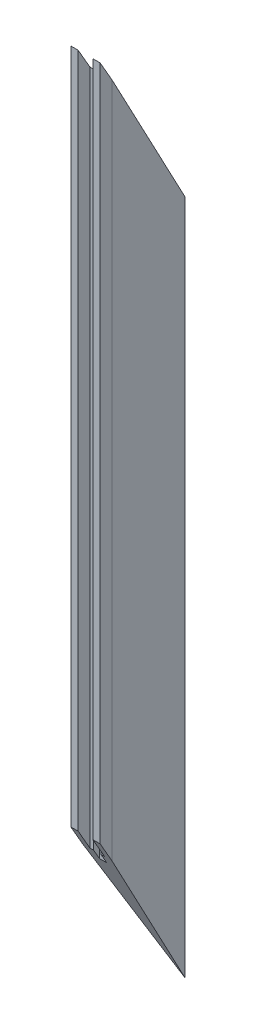
ISO-10303-21;
HEADER;
FILE_DESCRIPTION(('STEP AP214'),'2;1');
FILE_NAME('part.step','',(''),(''),'','','');
FILE_SCHEMA(('AUTOMOTIVE_DESIGN { 1 0 10303 214 1 1 1 1 }'));
ENDSEC;
DATA;
#1=APPLICATION_CONTEXT('core data for automotive mechanical design processes');
#2=APPLICATION_PROTOCOL_DEFINITION('international standard','automotive_design',2000,#1);
#3=PRODUCT_CONTEXT('',#1,'mechanical');
#4=PRODUCT('Part','Part','',(#3));
#5=PRODUCT_RELATED_PRODUCT_CATEGORY('part','',(#4));
#6=PRODUCT_DEFINITION_FORMATION('','',#4);
#7=PRODUCT_DEFINITION_CONTEXT('part definition',#1,'design');
#8=PRODUCT_DEFINITION('design','',#6,#7);
#9=PRODUCT_DEFINITION_SHAPE('','',#8);
#10=(LENGTH_UNIT() NAMED_UNIT(*) SI_UNIT(.MILLI.,.METRE.));
#11=(NAMED_UNIT(*) PLANE_ANGLE_UNIT() SI_UNIT($,.RADIAN.));
#12=(NAMED_UNIT(*) SI_UNIT($,.STERADIAN.) SOLID_ANGLE_UNIT());
#13=UNCERTAINTY_MEASURE_WITH_UNIT(LENGTH_MEASURE(1.E-05),#10,'distance_accuracy_value','');
#14=(GEOMETRIC_REPRESENTATION_CONTEXT(3) GLOBAL_UNCERTAINTY_ASSIGNED_CONTEXT((#13)) GLOBAL_UNIT_ASSIGNED_CONTEXT((#10,
#11,#12)) REPRESENTATION_CONTEXT('',''));
#15=CARTESIAN_POINT('',(0.,0.,0.));
#16=DIRECTION('',(0.,0.,1.));
#17=DIRECTION('',(1.,0.,0.));
#18=AXIS2_PLACEMENT_3D('',#15,#16,#17);
#19=CARTESIAN_POINT('',(0.,369.316,-2.54));
#20=DIRECTION('',(0.,0.,-1.));
#21=DIRECTION('',(-1.,0.,0.));
#22=AXIS2_PLACEMENT_3D('',#19,#20,#21);
#23=PLANE('',#22);
#24=DIRECTION('',(0.,-1.,0.));
#25=VECTOR('',#24,1.);
#26=CARTESIAN_POINT('',(-1.5875,369.316,-2.54));
#27=LINE('',#26,#25);
#28=CARTESIAN_POINT('',(-1.5875,356.064413852362,-2.54));
#29=VERTEX_POINT('',#28);
#30=CARTESIAN_POINT('',(-1.5875,62.9484138523619,-2.53999999999999));
#31=VERTEX_POINT('',#30);
#32=EDGE_CURVE('E214',#29,#31,#27,.T.);
#33=ORIENTED_EDGE('',*,*,#32,.T.);
#34=DIRECTION('',(1.,0.,0.));
#35=VECTOR('',#34,1.);
#36=CARTESIAN_POINT('',(0.,62.9484138523619,-2.54));
#37=LINE('',#36,#35);
#38=CARTESIAN_POINT('',(1.5875,62.9484138523619,-2.54));
#39=VERTEX_POINT('',#38);
#40=EDGE_CURVE('E62',#31,#39,#37,.T.);
#41=ORIENTED_EDGE('',*,*,#40,.T.);
#42=DIRECTION('',(0.,-1.,0.));
#43=VECTOR('',#42,1.);
#44=CARTESIAN_POINT('',(1.5875,369.316,-2.54));
#45=LINE('',#44,#43);
#46=CARTESIAN_POINT('',(1.5875,356.064413852362,-2.54));
#47=VERTEX_POINT('',#46);
#48=EDGE_CURVE('E55',#47,#39,#45,.T.);
#49=ORIENTED_EDGE('',*,*,#48,.F.);
#50=DIRECTION('',(-1.,0.,0.));
#51=VECTOR('',#50,1.);
#52=CARTESIAN_POINT('',(0.,356.064413852362,-2.54));
#53=LINE('',#52,#51);
#54=EDGE_CURVE('E212',#47,#29,#53,.T.);
#55=ORIENTED_EDGE('',*,*,#54,.T.);
#56=EDGE_LOOP('',(#33,#41,#49,#55));
#57=FACE_BOUND('',#56,.T.);
#58=ADVANCED_FACE('F47',(#57),#23,.F.);
#59=CARTESIAN_POINT('',(1.5875,369.316,0.));
#60=DIRECTION('',(1.,0.,0.));
#61=DIRECTION('',(0.,0.,-1.));
#62=AXIS2_PLACEMENT_3D('',#59,#60,#61);
#63=PLANE('',#62);
#64=ORIENTED_EDGE('',*,*,#48,.T.);
#65=DIRECTION('',(0.,0.866896748935602,0.498487739753831));
#66=VECTOR('',#65,1.);
#67=CARTESIAN_POINT('',(1.5875000000001,294.284339341271,130.484057089172));
#68=LINE('',#67,#66);
#69=CARTESIAN_POINT('',(1.5875,67.3656092349079,0.));
#70=VERTEX_POINT('',#69);
#71=EDGE_CURVE('E207',#39,#70,#68,.T.);
#72=ORIENTED_EDGE('',*,*,#71,.T.);
#73=DIRECTION('',(0.,-1.,0.));
#74=VECTOR('',#73,1.);
#75=CARTESIAN_POINT('',(1.5875,369.316,0.));
#76=LINE('',#75,#74);
#77=CARTESIAN_POINT('',(1.5875,360.481609234908,0.));
#78=VERTEX_POINT('',#77);
#79=EDGE_CURVE('E196',#78,#70,#76,.T.);
#80=ORIENTED_EDGE('',*,*,#79,.F.);
#81=DIRECTION('',(0.,-0.866896748935602,-0.498487739753831));
#82=VECTOR('',#81,1.);
#83=CARTESIAN_POINT('',(1.58750000000001,367.120742003038,3.81767066444079));
#84=LINE('',#83,#82);
#85=EDGE_CURVE('E208',#78,#47,#84,.T.);
#86=ORIENTED_EDGE('',*,*,#85,.T.);
#87=EDGE_LOOP('',(#64,#72,#80,#86));
#88=FACE_BOUND('',#87,.T.);
#89=ADVANCED_FACE('F205',(#88),#63,.F.);
#90=CARTESIAN_POINT('',(0.,369.316,0.));
#91=DIRECTION('',(0.,0.,-1.));
#92=DIRECTION('',(-1.,0.,0.));
#93=AXIS2_PLACEMENT_3D('',#90,#91,#92);
#94=PLANE('',#93);
#95=ORIENTED_EDGE('',*,*,#79,.T.);
#96=DIRECTION('',(1.,0.,0.));
#97=VECTOR('',#96,1.);
#98=CARTESIAN_POINT('',(0.,67.365609234908,0.));
#99=LINE('',#98,#97);
#100=CARTESIAN_POINT('',(3.175,67.365609234908,0.));
#101=VERTEX_POINT('',#100);
#102=EDGE_CURVE('E219',#70,#101,#99,.T.);
#103=ORIENTED_EDGE('',*,*,#102,.T.);
#104=DIRECTION('',(0.,-1.,0.));
#105=VECTOR('',#104,1.);
#106=CARTESIAN_POINT('',(3.175,369.316,0.));
#107=LINE('',#106,#105);
#108=CARTESIAN_POINT('',(3.175,360.481609234908,0.));
#109=VERTEX_POINT('',#108);
#110=EDGE_CURVE('E192',#109,#101,#107,.T.);
#111=ORIENTED_EDGE('',*,*,#110,.F.);
#112=DIRECTION('',(-1.,0.,0.));
#113=VECTOR('',#112,1.);
#114=CARTESIAN_POINT('',(0.,360.481609234908,0.));
#115=LINE('',#114,#113);
#116=EDGE_CURVE('E260',#109,#78,#115,.T.);
#117=ORIENTED_EDGE('',*,*,#116,.T.);
#118=EDGE_LOOP('',(#95,#103,#111,#117));
#119=FACE_BOUND('',#118,.T.);
#120=ADVANCED_FACE('F319',(#119),#94,.F.);
#121=CARTESIAN_POINT('',(3.175,369.316,0.));
#122=DIRECTION('',(1.,0.,0.));
#123=DIRECTION('',(0.,0.,-1.));
#124=AXIS2_PLACEMENT_3D('',#121,#122,#123);
#125=PLANE('',#124);
#126=ORIENTED_EDGE('',*,*,#110,.T.);
#127=DIRECTION('',(0.,0.866896748935602,0.498487739753831));
#128=VECTOR('',#127,1.);
#129=CARTESIAN_POINT('',(3.175,294.284339341271,130.484057089172));
#130=LINE('',#129,#128);
#131=CARTESIAN_POINT('',(3.175,76.2,5.08));
#132=VERTEX_POINT('',#131);
#133=EDGE_CURVE('E228',#101,#132,#130,.T.);
#134=ORIENTED_EDGE('',*,*,#133,.T.);
#135=DIRECTION('',(0.,-1.,0.));
#136=VECTOR('',#135,1.);
#137=CARTESIAN_POINT('',(3.175,369.316,5.08));
#138=LINE('',#137,#136);
#139=CARTESIAN_POINT('',(3.175,369.316,5.08));
#140=VERTEX_POINT('',#139);
#141=EDGE_CURVE('E188',#140,#132,#138,.T.);
#142=ORIENTED_EDGE('',*,*,#141,.F.);
#143=DIRECTION('',(0.,-0.866896748935602,-0.498487739753831));
#144=VECTOR('',#143,1.);
#145=CARTESIAN_POINT('',(3.175,367.120742003038,3.81767066444079));
#146=LINE('',#145,#144);
#147=EDGE_CURVE('E69',#140,#109,#146,.T.);
#148=ORIENTED_EDGE('',*,*,#147,.T.);
#149=EDGE_LOOP('',(#126,#134,#142,#148));
#150=FACE_BOUND('',#149,.T.);
#151=ADVANCED_FACE('F316',(#150),#125,.F.);
#152=CARTESIAN_POINT('',(0.,369.316,5.08));
#153=DIRECTION('',(0.,0.,-1.));
#154=DIRECTION('',(-1.,0.,0.));
#155=AXIS2_PLACEMENT_3D('',#152,#153,#154);
#156=PLANE('',#155);
#157=ORIENTED_EDGE('',*,*,#141,.T.);
#158=DIRECTION('',(-1.,0.,0.));
#159=VECTOR('',#158,1.);
#160=CARTESIAN_POINT('',(11.176,76.2,5.08));
#161=LINE('',#160,#159);
#162=CARTESIAN_POINT('',(6.35,76.2,5.08));
#163=VERTEX_POINT('',#162);
#164=EDGE_CURVE('E151',#163,#132,#161,.T.);
#165=ORIENTED_EDGE('',*,*,#164,.F.);
#166=DIRECTION('',(0.,-1.,0.));
#167=VECTOR('',#166,1.);
#168=CARTESIAN_POINT('',(6.35,369.316,5.08));
#169=LINE('',#168,#167);
#170=CARTESIAN_POINT('',(6.35,369.316,5.08));
#171=VERTEX_POINT('',#170);
#172=EDGE_CURVE('E184',#171,#163,#169,.T.);
#173=ORIENTED_EDGE('',*,*,#172,.F.);
#174=DIRECTION('',(1.,0.,0.));
#175=VECTOR('',#174,1.);
#176=CARTESIAN_POINT('',(0.,369.316,5.08));
#177=LINE('',#176,#175);
#178=EDGE_CURVE('E277',#140,#171,#177,.T.);
#179=ORIENTED_EDGE('',*,*,#178,.F.);
#180=EDGE_LOOP('',(#157,#165,#173,#179));
#181=FACE_BOUND('',#180,.T.);
#182=ADVANCED_FACE('F311',(#181),#156,.F.);
#183=CARTESIAN_POINT('',(6.35,369.316,0.));
#184=DIRECTION('',(-1.,0.,0.));
#185=DIRECTION('',(0.,0.,1.));
#186=AXIS2_PLACEMENT_3D('',#183,#184,#185);
#187=PLANE('',#186);
#188=ORIENTED_EDGE('',*,*,#172,.T.);
#189=DIRECTION('',(0.,-0.866896748935602,-0.498487739753831));
#190=VECTOR('',#189,1.);
#191=CARTESIAN_POINT('',(6.35,294.284339341271,130.484057089172));
#192=LINE('',#191,#190);
#193=CARTESIAN_POINT('',(6.35,67.365609234908,0.));
#194=VERTEX_POINT('',#193);
#195=EDGE_CURVE('E238',#163,#194,#192,.T.);
#196=ORIENTED_EDGE('',*,*,#195,.T.);
#197=DIRECTION('',(0.,-1.,0.));
#198=VECTOR('',#197,1.);
#199=CARTESIAN_POINT('',(6.35,369.316,0.));
#200=LINE('',#199,#198);
#201=CARTESIAN_POINT('',(6.35,360.481609234908,0.));
#202=VERTEX_POINT('',#201);
#203=EDGE_CURVE('E180',#202,#194,#200,.T.);
#204=ORIENTED_EDGE('',*,*,#203,.F.);
#205=DIRECTION('',(0.,0.866896748935602,0.498487739753831));
#206=VECTOR('',#205,1.);
#207=CARTESIAN_POINT('',(6.35,367.120742003038,3.81767066444079));
#208=LINE('',#207,#206);
#209=EDGE_CURVE('E273',#202,#171,#208,.T.);
#210=ORIENTED_EDGE('',*,*,#209,.T.);
#211=EDGE_LOOP('',(#188,#196,#204,#210));
#212=FACE_BOUND('',#211,.T.);
#213=ADVANCED_FACE('F307',(#212),#187,.F.);
#214=CARTESIAN_POINT('',(6.17837837837838,369.316,-1.02972972972973));
#215=DIRECTION('',(0.986393923832144,0.,-0.164398987305357));
#216=DIRECTION('',(-0.164398987305357,0.,-0.986393923832144));
#217=AXIS2_PLACEMENT_3D('',#214,#215,#216);
#218=PLANE('',#217);
#219=DIRECTION('',(0.0827960315270938,0.863920271231371,0.496776189162563));
#220=VECTOR('',#219,1.);
#221=CARTESIAN_POINT('',(27.9047304257473,292.274559727748,129.328382554484));
#222=LINE('',#221,#220);
#223=CARTESIAN_POINT('',(0.,1.10767849671754,-38.1));
#224=VERTEX_POINT('',#223);
#225=EDGE_CURVE('E235',#224,#194,#222,.T.);
#226=ORIENTED_EDGE('',*,*,#225,.F.);
#227=DIRECTION('',(0.,-1.,0.));
#228=VECTOR('',#227,1.);
#229=CARTESIAN_POINT('',(0.,369.316,-38.1));
#230=LINE('',#229,#228);
#231=CARTESIAN_POINT('',(0.,294.223678496717,-38.1));
#232=VERTEX_POINT('',#231);
#233=EDGE_CURVE('E171',#232,#224,#230,.T.);
#234=ORIENTED_EDGE('',*,*,#233,.F.);
#235=DIRECTION('',(-0.0827960315270937,-0.863920271231371,-0.496776189162562));
#236=VECTOR('',#235,1.);
#237=CARTESIAN_POINT('',(6.9383862279917,366.621019304448,3.53031736795018));
#238=LINE('',#237,#236);
#239=EDGE_CURVE('E270',#202,#232,#238,.T.);
#240=ORIENTED_EDGE('',*,*,#239,.F.);
#241=ORIENTED_EDGE('',*,*,#203,.T.);
#242=EDGE_LOOP('',(#226,#234,#240,#241));
#243=FACE_BOUND('',#242,.T.);
#244=ADVANCED_FACE('F303',(#243),#218,.T.);
#245=CARTESIAN_POINT('',(-6.17837837837838,369.316,-1.02972972972973));
#246=DIRECTION('',(0.986393923832144,0.,0.164398987305357));
#247=DIRECTION('',(0.164398987305357,0.,-0.986393923832144));
#248=AXIS2_PLACEMENT_3D('',#245,#246,#247);
#249=PLANE('',#248);
#250=ORIENTED_EDGE('',*,*,#233,.T.);
#251=DIRECTION('',(-0.0827960315270938,0.863920271231371,0.496776189162563));
#252=VECTOR('',#251,1.);
#253=CARTESIAN_POINT('',(-27.9047304257473,292.274559727748,129.328382554484));
#254=LINE('',#253,#252);
#255=CARTESIAN_POINT('',(-6.35,67.365609234908,0.));
#256=VERTEX_POINT('',#255);
#257=EDGE_CURVE('E232',#224,#256,#254,.T.);
#258=ORIENTED_EDGE('',*,*,#257,.T.);
#259=DIRECTION('',(0.,-1.,0.));
#260=VECTOR('',#259,1.);
#261=CARTESIAN_POINT('',(-6.35,369.316,0.));
#262=LINE('',#261,#260);
#263=CARTESIAN_POINT('',(-6.35,360.481609234908,0.));
#264=VERTEX_POINT('',#263);
#265=EDGE_CURVE('E161',#264,#256,#262,.T.);
#266=ORIENTED_EDGE('',*,*,#265,.F.);
#267=DIRECTION('',(0.0827960315270937,-0.863920271231371,-0.496776189162562));
#268=VECTOR('',#267,1.);
#269=CARTESIAN_POINT('',(-6.9383862279917,366.621019304448,3.53031736795018));
#270=LINE('',#269,#268);
#271=EDGE_CURVE('E266',#264,#232,#270,.T.);
#272=ORIENTED_EDGE('',*,*,#271,.T.);
#273=EDGE_LOOP('',(#250,#258,#266,#272));
#274=FACE_BOUND('',#273,.T.);
#275=ADVANCED_FACE('F299',(#274),#249,.F.);
#276=CARTESIAN_POINT('',(-6.35,369.316,0.));
#277=DIRECTION('',(-1.,0.,0.));
#278=DIRECTION('',(0.,0.,1.));
#279=AXIS2_PLACEMENT_3D('',#276,#277,#278);
#280=PLANE('',#279);
#281=DIRECTION('',(0.,-0.866896748935602,-0.498487739753831));
#282=VECTOR('',#281,1.);
#283=CARTESIAN_POINT('',(-6.35,76.2,5.08));
#284=LINE('',#283,#282);
#285=CARTESIAN_POINT('',(-6.35,76.2,5.08));
#286=VERTEX_POINT('',#285);
#287=EDGE_CURVE('E142',#286,#256,#284,.T.);
#288=ORIENTED_EDGE('',*,*,#287,.F.);
#289=DIRECTION('',(0.,-1.,0.));
#290=VECTOR('',#289,1.);
#291=CARTESIAN_POINT('',(-6.35,369.316,5.08));
#292=LINE('',#291,#290);
#293=CARTESIAN_POINT('',(-6.35,369.316,5.08));
#294=VERTEX_POINT('',#293);
#295=EDGE_CURVE('E158',#294,#286,#292,.T.);
#296=ORIENTED_EDGE('',*,*,#295,.F.);
#297=DIRECTION('',(0.,0.866896748935602,0.498487739753831));
#298=VECTOR('',#297,1.);
#299=CARTESIAN_POINT('',(-6.35,369.316,5.08));
#300=LINE('',#299,#298);
#301=EDGE_CURVE('E242',#264,#294,#300,.T.);
#302=ORIENTED_EDGE('',*,*,#301,.F.);
#303=ORIENTED_EDGE('',*,*,#265,.T.);
#304=EDGE_LOOP('',(#288,#296,#302,#303));
#305=FACE_BOUND('',#304,.T.);
#306=ADVANCED_FACE('F156',(#305),#280,.T.);
#307=CARTESIAN_POINT('',(0.,369.316,5.08));
#308=DIRECTION('',(0.,0.,1.));
#309=DIRECTION('',(1.,0.,0.));
#310=AXIS2_PLACEMENT_3D('',#307,#308,#309);
#311=PLANE('',#310);
#312=CARTESIAN_POINT('',(-3.175,76.2,5.08));
#313=VERTEX_POINT('',#312);
#314=EDGE_CURVE('E139',#313,#286,#161,.T.);
#315=ORIENTED_EDGE('',*,*,#314,.F.);
#316=DIRECTION('',(0.,-1.,0.));
#317=VECTOR('',#316,1.);
#318=CARTESIAN_POINT('',(-3.175,369.316,5.08));
#319=LINE('',#318,#317);
#320=CARTESIAN_POINT('',(-3.175,369.316,5.08));
#321=VERTEX_POINT('',#320);
#322=EDGE_CURVE('E167',#321,#313,#319,.T.);
#323=ORIENTED_EDGE('',*,*,#322,.F.);
#324=DIRECTION('',(-1.,0.,0.));
#325=VECTOR('',#324,1.);
#326=CARTESIAN_POINT('',(0.,369.316,5.08));
#327=LINE('',#326,#325);
#328=EDGE_CURVE('E165',#321,#294,#327,.T.);
#329=ORIENTED_EDGE('',*,*,#328,.T.);
#330=ORIENTED_EDGE('',*,*,#295,.T.);
#331=EDGE_LOOP('',(#315,#323,#329,#330));
#332=FACE_BOUND('',#331,.T.);
#333=ADVANCED_FACE('F164',(#332),#311,.T.);
#334=CARTESIAN_POINT('',(-3.175,369.316,0.));
#335=DIRECTION('',(1.,0.,0.));
#336=DIRECTION('',(0.,0.,-1.));
#337=AXIS2_PLACEMENT_3D('',#334,#335,#336);
#338=PLANE('',#337);
#339=DIRECTION('',(0.,0.866896748935602,0.498487739753831));
#340=VECTOR('',#339,1.);
#341=CARTESIAN_POINT('',(-3.17499999999998,294.284339341271,130.484057089172));
#342=LINE('',#341,#340);
#343=CARTESIAN_POINT('',(-3.175,67.365609234908,0.));
#344=VERTEX_POINT('',#343);
#345=EDGE_CURVE('E145',#344,#313,#342,.T.);
#346=ORIENTED_EDGE('',*,*,#345,.F.);
#347=DIRECTION('',(0.,-1.,0.));
#348=VECTOR('',#347,1.);
#349=CARTESIAN_POINT('',(-3.175,369.316,0.));
#350=LINE('',#349,#348);
#351=CARTESIAN_POINT('',(-3.175,360.481609234908,0.));
#352=VERTEX_POINT('',#351);
#353=EDGE_CURVE('E173',#352,#344,#350,.T.);
#354=ORIENTED_EDGE('',*,*,#353,.F.);
#355=DIRECTION('',(0.,-0.866896748935602,-0.498487739753831));
#356=VECTOR('',#355,1.);
#357=CARTESIAN_POINT('',(-3.175,367.120742003038,3.81767066444079));
#358=LINE('',#357,#356);
#359=EDGE_CURVE('E253',#321,#352,#358,.T.);
#360=ORIENTED_EDGE('',*,*,#359,.F.);
#361=ORIENTED_EDGE('',*,*,#322,.T.);
#362=EDGE_LOOP('',(#346,#354,#360,#361));
#363=FACE_BOUND('',#362,.T.);
#364=ADVANCED_FACE('F296',(#363),#338,.T.);
#365=CARTESIAN_POINT('',(0.,369.316,0.));
#366=DIRECTION('',(0.,0.,-1.));
#367=DIRECTION('',(-1.,0.,0.));
#368=AXIS2_PLACEMENT_3D('',#365,#366,#367);
#369=PLANE('',#368);
#370=ORIENTED_EDGE('',*,*,#353,.T.);
#371=DIRECTION('',(1.,0.,0.));
#372=VECTOR('',#371,1.);
#373=CARTESIAN_POINT('',(-1.286143230663E-13,67.365609234908,0.));
#374=LINE('',#373,#372);
#375=CARTESIAN_POINT('',(-1.5875,67.3656092349079,0.));
#376=VERTEX_POINT('',#375);
#377=EDGE_CURVE('E221',#344,#376,#374,.T.);
#378=ORIENTED_EDGE('',*,*,#377,.T.);
#379=DIRECTION('',(0.,-1.,0.));
#380=VECTOR('',#379,1.);
#381=CARTESIAN_POINT('',(-1.5875,369.316,0.));
#382=LINE('',#381,#380);
#383=CARTESIAN_POINT('',(-1.5875,360.481609234908,0.));
#384=VERTEX_POINT('',#383);
#385=EDGE_CURVE('E284',#384,#376,#382,.T.);
#386=ORIENTED_EDGE('',*,*,#385,.F.);
#387=DIRECTION('',(-1.,0.,0.));
#388=VECTOR('',#387,1.);
#389=CARTESIAN_POINT('',(0.,360.481609234908,0.));
#390=LINE('',#389,#388);
#391=EDGE_CURVE('E249',#384,#352,#390,.T.);
#392=ORIENTED_EDGE('',*,*,#391,.T.);
#393=EDGE_LOOP('',(#370,#378,#386,#392));
#394=FACE_BOUND('',#393,.T.);
#395=ADVANCED_FACE('F292',(#394),#369,.F.);
#396=CARTESIAN_POINT('',(-1.5875,369.316,0.));
#397=DIRECTION('',(-1.,0.,0.));
#398=DIRECTION('',(0.,0.,1.));
#399=AXIS2_PLACEMENT_3D('',#396,#397,#398);
#400=PLANE('',#399);
#401=ORIENTED_EDGE('',*,*,#385,.T.);
#402=DIRECTION('',(0.,-0.866896748935602,-0.498487739753831));
#403=VECTOR('',#402,1.);
#404=CARTESIAN_POINT('',(-1.5875,294.284339341271,130.484057089172));
#405=LINE('',#404,#403);
#406=EDGE_CURVE('E11',#376,#31,#405,.T.);
#407=ORIENTED_EDGE('',*,*,#406,.T.);
#408=ORIENTED_EDGE('',*,*,#32,.F.);
#409=DIRECTION('',(0.,0.866896748935602,0.498487739753831));
#410=VECTOR('',#409,1.);
#411=CARTESIAN_POINT('',(-1.5875,367.120742003038,3.81767066444079));
#412=LINE('',#411,#410);
#413=EDGE_CURVE('E245',#29,#384,#412,.T.);
#414=ORIENTED_EDGE('',*,*,#413,.T.);
#415=EDGE_LOOP('',(#401,#407,#408,#414));
#416=FACE_BOUND('',#415,.T.);
#417=ADVANCED_FACE('F321',(#416),#400,.F.);
#418=CARTESIAN_POINT('',(11.176,369.316,5.08));
#419=DIRECTION('',(0.,-0.498487739753831,0.866896748935602));
#420=DIRECTION('',(0.,-0.866896748935602,-0.498487739753831));
#421=AXIS2_PLACEMENT_3D('',#418,#419,#420);
#422=PLANE('',#421);
#423=ORIENTED_EDGE('',*,*,#239,.T.);
#424=ORIENTED_EDGE('',*,*,#271,.F.);
#425=ORIENTED_EDGE('',*,*,#301,.T.);
#426=ORIENTED_EDGE('',*,*,#328,.F.);
#427=ORIENTED_EDGE('',*,*,#359,.T.);
#428=ORIENTED_EDGE('',*,*,#391,.F.);
#429=ORIENTED_EDGE('',*,*,#413,.F.);
#430=ORIENTED_EDGE('',*,*,#54,.F.);
#431=ORIENTED_EDGE('',*,*,#85,.F.);
#432=ORIENTED_EDGE('',*,*,#116,.F.);
#433=ORIENTED_EDGE('',*,*,#147,.F.);
#434=ORIENTED_EDGE('',*,*,#178,.T.);
#435=ORIENTED_EDGE('',*,*,#209,.F.);
#436=EDGE_LOOP('',(#423,#424,#425,#426,#427,#428,#429,#430,#431,#432,#433,#434,#435));
#437=FACE_BOUND('',#436,.T.);
#438=ADVANCED_FACE('F297',(#437),#422,.F.);
#439=CARTESIAN_POINT('',(11.176,76.2,5.08));
#440=DIRECTION('',(0.,0.498487739753831,-0.866896748935602));
#441=DIRECTION('',(0.,0.866896748935602,0.498487739753831));
#442=AXIS2_PLACEMENT_3D('',#439,#440,#441);
#443=PLANE('',#442);
#444=ORIENTED_EDGE('',*,*,#164,.T.);
#445=ORIENTED_EDGE('',*,*,#133,.F.);
#446=ORIENTED_EDGE('',*,*,#102,.F.);
#447=ORIENTED_EDGE('',*,*,#71,.F.);
#448=ORIENTED_EDGE('',*,*,#40,.F.);
#449=ORIENTED_EDGE('',*,*,#406,.F.);
#450=ORIENTED_EDGE('',*,*,#377,.F.);
#451=ORIENTED_EDGE('',*,*,#345,.T.);
#452=ORIENTED_EDGE('',*,*,#314,.T.);
#453=ORIENTED_EDGE('',*,*,#287,.T.);
#454=ORIENTED_EDGE('',*,*,#257,.F.);
#455=ORIENTED_EDGE('',*,*,#225,.T.);
#456=ORIENTED_EDGE('',*,*,#195,.F.);
#457=EDGE_LOOP('',(#444,#445,#446,#447,#448,#449,#450,#451,#452,#453,#454,#455,#456));
#458=FACE_BOUND('',#457,.T.);
#459=ADVANCED_FACE('F141',(#458),#443,.F.);
#460=CLOSED_SHELL('',(#58,#89,#120,#151,#182,#213,#244,#275,#306,#333,#364,#395,#417,#438,#459));
#461=MANIFOLD_SOLID_BREP('B2',#460);
#462=ADVANCED_BREP_SHAPE_REPRESENTATION('',(#18,#461),#14);
#463=SHAPE_DEFINITION_REPRESENTATION(#9,#462);
ENDSEC;
END-ISO-10303-21;
